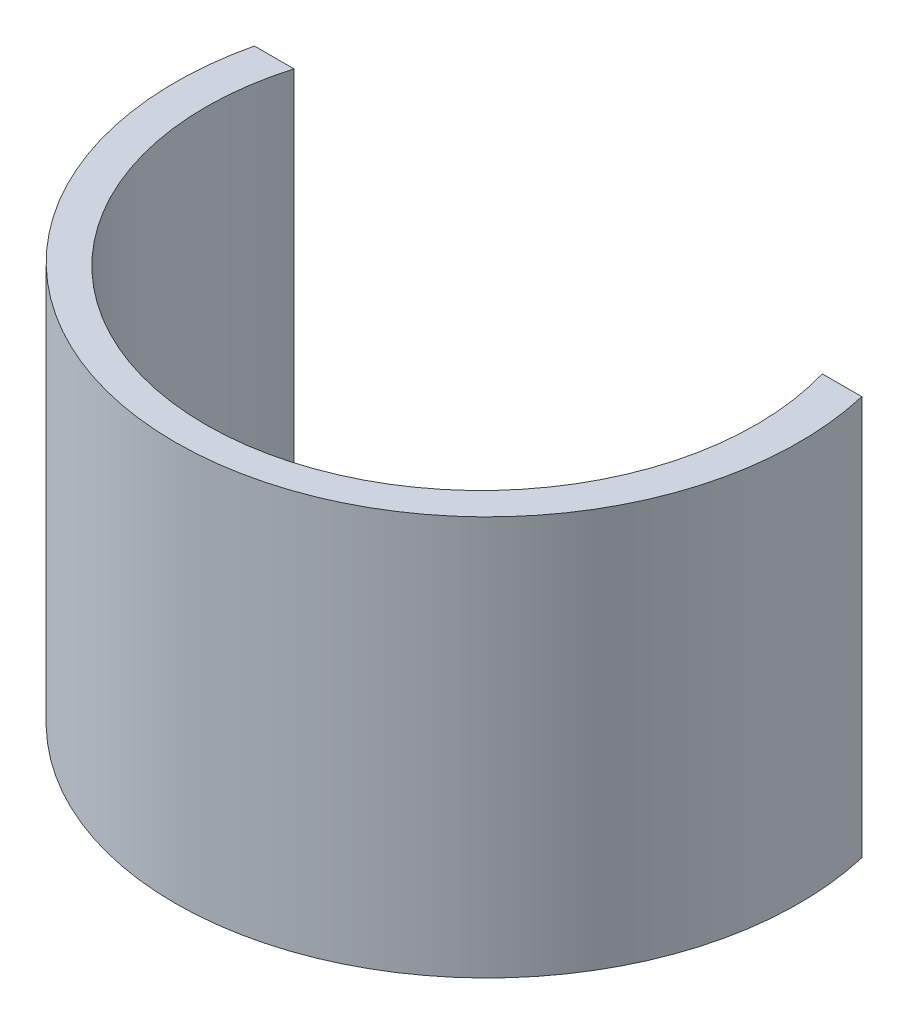
ISO-10303-21;
HEADER;
FILE_DESCRIPTION(('STEP AP214'),'2;1');
FILE_NAME('part.step','',(''),(''),'','','');
FILE_SCHEMA(('AUTOMOTIVE_DESIGN { 1 0 10303 214 1 1 1 1 }'));
ENDSEC;
DATA;
#1=APPLICATION_CONTEXT('core data for automotive mechanical design processes');
#2=APPLICATION_PROTOCOL_DEFINITION('international standard','automotive_design',2000,#1);
#3=PRODUCT_CONTEXT('',#1,'mechanical');
#4=PRODUCT('Part','Part','',(#3));
#5=PRODUCT_RELATED_PRODUCT_CATEGORY('part','',(#4));
#6=PRODUCT_DEFINITION_FORMATION('','',#4);
#7=PRODUCT_DEFINITION_CONTEXT('part definition',#1,'design');
#8=PRODUCT_DEFINITION('design','',#6,#7);
#9=PRODUCT_DEFINITION_SHAPE('','',#8);
#10=(LENGTH_UNIT() NAMED_UNIT(*) SI_UNIT(.MILLI.,.METRE.));
#11=(NAMED_UNIT(*) PLANE_ANGLE_UNIT() SI_UNIT($,.RADIAN.));
#12=(NAMED_UNIT(*) SI_UNIT($,.STERADIAN.) SOLID_ANGLE_UNIT());
#13=UNCERTAINTY_MEASURE_WITH_UNIT(LENGTH_MEASURE(1.E-05),#10,'distance_accuracy_value','');
#14=(GEOMETRIC_REPRESENTATION_CONTEXT(3) GLOBAL_UNCERTAINTY_ASSIGNED_CONTEXT((#13)) GLOBAL_UNIT_ASSIGNED_CONTEXT((#10,
#11,#12)) REPRESENTATION_CONTEXT('',''));
#15=CARTESIAN_POINT('',(0.,0.,0.));
#16=DIRECTION('',(0.,0.,1.));
#17=DIRECTION('',(1.,0.,0.));
#18=AXIS2_PLACEMENT_3D('',#15,#16,#17);
#19=CARTESIAN_POINT('',(0.,-31.,-20.0000000000004));
#20=DIRECTION('',(0.,0.,-1.));
#21=DIRECTION('',(-1.,0.,0.));
#22=AXIS2_PLACEMENT_3D('',#19,#20,#21);
#23=PLANE('',#22);
#24=DIRECTION('',(0.,1.,0.));
#25=VECTOR('',#24,1.);
#26=CARTESIAN_POINT('',(66.805,-31.,-20.0000000000004));
#27=LINE('',#26,#25);
#28=CARTESIAN_POINT('',(66.805,-31.,-20.0000000000004));
#29=VERTEX_POINT('',#28);
#30=CARTESIAN_POINT('',(66.805,70.,-20.0000000000004));
#31=VERTEX_POINT('',#30);
#32=EDGE_CURVE('E40',#29,#31,#27,.T.);
#33=ORIENTED_EDGE('',*,*,#32,.T.);
#34=DIRECTION('',(-1.,0.,0.));
#35=VECTOR('',#34,1.);
#36=CARTESIAN_POINT('',(0.,70.,-20.0000000000004));
#37=LINE('',#36,#35);
#38=CARTESIAN_POINT('',(76.805,70.,-20.0000000000004));
#39=VERTEX_POINT('',#38);
#40=EDGE_CURVE('E77',#39,#31,#37,.T.);
#41=ORIENTED_EDGE('',*,*,#40,.F.);
#42=DIRECTION('',(0.,1.,0.));
#43=VECTOR('',#42,1.);
#44=CARTESIAN_POINT('',(76.805,-31.,-20.0000000000004));
#45=LINE('',#44,#43);
#46=CARTESIAN_POINT('',(76.805,-31.,-20.0000000000004));
#47=VERTEX_POINT('',#46);
#48=EDGE_CURVE('E11',#47,#39,#45,.T.);
#49=ORIENTED_EDGE('',*,*,#48,.F.);
#50=DIRECTION('',(-1.,0.,0.));
#51=VECTOR('',#50,1.);
#52=CARTESIAN_POINT('',(0.,-31.,-20.0000000000004));
#53=LINE('',#52,#51);
#54=EDGE_CURVE('E79',#47,#29,#53,.T.);
#55=ORIENTED_EDGE('',*,*,#54,.T.);
#56=EDGE_LOOP('',(#33,#41,#49,#55));
#57=FACE_BOUND('',#56,.T.);
#58=ADVANCED_FACE('F37',(#57),#23,.T.);
#59=CARTESIAN_POINT('',(0.,-31.,-2.0660089871392));
#60=DIRECTION('',(0.,1.,0.));
#61=DIRECTION('',(0.,0.,1.));
#62=AXIS2_PLACEMENT_3D('',#59,#60,#61);
#63=CYLINDRICAL_SURFACE('',#62,78.8710089871391);
#64=ORIENTED_EDGE('',*,*,#48,.T.);
#65=CARTESIAN_POINT('',(0.,70.,-2.0660089871392));
#66=DIRECTION('',(0.,1.,0.));
#67=DIRECTION('',(0.,0.,1.));
#68=AXIS2_PLACEMENT_3D('',#65,#66,#67);
#69=CIRCLE('',#68,78.8710089871391);
#70=CARTESIAN_POINT('',(-76.805,70.,-20.0000000000004));
#71=VERTEX_POINT('',#70);
#72=EDGE_CURVE('E95',#39,#71,#69,.F.);
#73=ORIENTED_EDGE('',*,*,#72,.T.);
#74=DIRECTION('',(0.,1.,0.));
#75=VECTOR('',#74,1.);
#76=CARTESIAN_POINT('',(-76.805,-31.,-20.0000000000004));
#77=LINE('',#76,#75);
#78=CARTESIAN_POINT('',(-76.805,-31.,-20.0000000000004));
#79=VERTEX_POINT('',#78);
#80=EDGE_CURVE('E45',#79,#71,#77,.T.);
#81=ORIENTED_EDGE('',*,*,#80,.F.);
#82=CARTESIAN_POINT('',(0.,-31.,-2.0660089871392));
#83=DIRECTION('',(0.,1.,0.));
#84=DIRECTION('',(0.,0.,1.));
#85=AXIS2_PLACEMENT_3D('',#82,#83,#84);
#86=CIRCLE('',#85,78.8710089871391);
#87=EDGE_CURVE('E58',#47,#79,#86,.F.);
#88=ORIENTED_EDGE('',*,*,#87,.F.);
#89=EDGE_LOOP('',(#64,#73,#81,#88));
#90=FACE_BOUND('',#89,.T.);
#91=ADVANCED_FACE('F110',(#90),#63,.T.);
#92=CARTESIAN_POINT('',(0.,-31.,-20.0000000000004));
#93=DIRECTION('',(0.,0.,1.));
#94=DIRECTION('',(1.,0.,0.));
#95=AXIS2_PLACEMENT_3D('',#92,#93,#94);
#96=PLANE('',#95);
#97=ORIENTED_EDGE('',*,*,#80,.T.);
#98=DIRECTION('',(1.,0.,0.));
#99=VECTOR('',#98,1.);
#100=CARTESIAN_POINT('',(0.,70.,-20.0000000000004));
#101=LINE('',#100,#99);
#102=CARTESIAN_POINT('',(-66.805,70.,-20.0000000000004));
#103=VERTEX_POINT('',#102);
#104=EDGE_CURVE('E91',#71,#103,#101,.T.);
#105=ORIENTED_EDGE('',*,*,#104,.T.);
#106=DIRECTION('',(0.,1.,0.));
#107=VECTOR('',#106,1.);
#108=CARTESIAN_POINT('',(-66.805,-31.,-20.0000000000004));
#109=LINE('',#108,#107);
#110=CARTESIAN_POINT('',(-66.805,-31.,-20.0000000000004));
#111=VERTEX_POINT('',#110);
#112=EDGE_CURVE('E83',#111,#103,#109,.T.);
#113=ORIENTED_EDGE('',*,*,#112,.F.);
#114=DIRECTION('',(1.,0.,0.));
#115=VECTOR('',#114,1.);
#116=CARTESIAN_POINT('',(0.,-31.,-20.0000000000004));
#117=LINE('',#116,#115);
#118=EDGE_CURVE('E103',#79,#111,#117,.T.);
#119=ORIENTED_EDGE('',*,*,#118,.F.);
#120=EDGE_LOOP('',(#97,#105,#113,#119));
#121=FACE_BOUND('',#120,.T.);
#122=ADVANCED_FACE('F108',(#121),#96,.F.);
#123=CARTESIAN_POINT('',(0.,-31.,-0.495931455323742));
#124=DIRECTION('',(0.,1.,0.));
#125=DIRECTION('',(0.,0.,1.));
#126=AXIS2_PLACEMENT_3D('',#123,#124,#125);
#127=CYLINDRICAL_SURFACE('',#126,69.5939416529589);
#128=ORIENTED_EDGE('',*,*,#112,.T.);
#129=CARTESIAN_POINT('',(0.,70.,-0.495931455323742));
#130=DIRECTION('',(0.,1.,0.));
#131=DIRECTION('',(0.,0.,1.));
#132=AXIS2_PLACEMENT_3D('',#129,#130,#131);
#133=CIRCLE('',#132,69.5939416529589);
#134=EDGE_CURVE('E85',#31,#103,#133,.F.);
#135=ORIENTED_EDGE('',*,*,#134,.F.);
#136=ORIENTED_EDGE('',*,*,#32,.F.);
#137=CARTESIAN_POINT('',(0.,-31.,-0.495931455323742));
#138=DIRECTION('',(0.,1.,0.));
#139=DIRECTION('',(0.,0.,1.));
#140=AXIS2_PLACEMENT_3D('',#137,#138,#139);
#141=CIRCLE('',#140,69.5939416529589);
#142=EDGE_CURVE('E101',#29,#111,#141,.F.);
#143=ORIENTED_EDGE('',*,*,#142,.T.);
#144=EDGE_LOOP('',(#128,#135,#136,#143));
#145=FACE_BOUND('',#144,.T.);
#146=ADVANCED_FACE('F86',(#145),#127,.F.);
#147=CARTESIAN_POINT('',(0.,-31.,0.));
#148=DIRECTION('',(0.,1.,0.));
#149=DIRECTION('',(0.,0.,1.));
#150=AXIS2_PLACEMENT_3D('',#147,#148,#149);
#151=PLANE('',#150);
#152=ORIENTED_EDGE('',*,*,#54,.F.);
#153=ORIENTED_EDGE('',*,*,#87,.T.);
#154=ORIENTED_EDGE('',*,*,#118,.T.);
#155=ORIENTED_EDGE('',*,*,#142,.F.);
#156=EDGE_LOOP('',(#152,#153,#154,#155));
#157=FACE_BOUND('',#156,.T.);
#158=ADVANCED_FACE('F111',(#157),#151,.F.);
#159=CARTESIAN_POINT('',(0.,70.,0.));
#160=DIRECTION('',(0.,1.,0.));
#161=DIRECTION('',(0.,0.,1.));
#162=AXIS2_PLACEMENT_3D('',#159,#160,#161);
#163=PLANE('',#162);
#164=ORIENTED_EDGE('',*,*,#40,.T.);
#165=ORIENTED_EDGE('',*,*,#134,.T.);
#166=ORIENTED_EDGE('',*,*,#104,.F.);
#167=ORIENTED_EDGE('',*,*,#72,.F.);
#168=EDGE_LOOP('',(#164,#165,#166,#167));
#169=FACE_BOUND('',#168,.T.);
#170=ADVANCED_FACE('F93',(#169),#163,.T.);
#171=CLOSED_SHELL('',(#58,#91,#122,#146,#158,#170));
#172=MANIFOLD_SOLID_BREP('B2',#171);
#173=ADVANCED_BREP_SHAPE_REPRESENTATION('',(#18,#172),#14);
#174=SHAPE_DEFINITION_REPRESENTATION(#9,#173);
ENDSEC;
END-ISO-10303-21;
